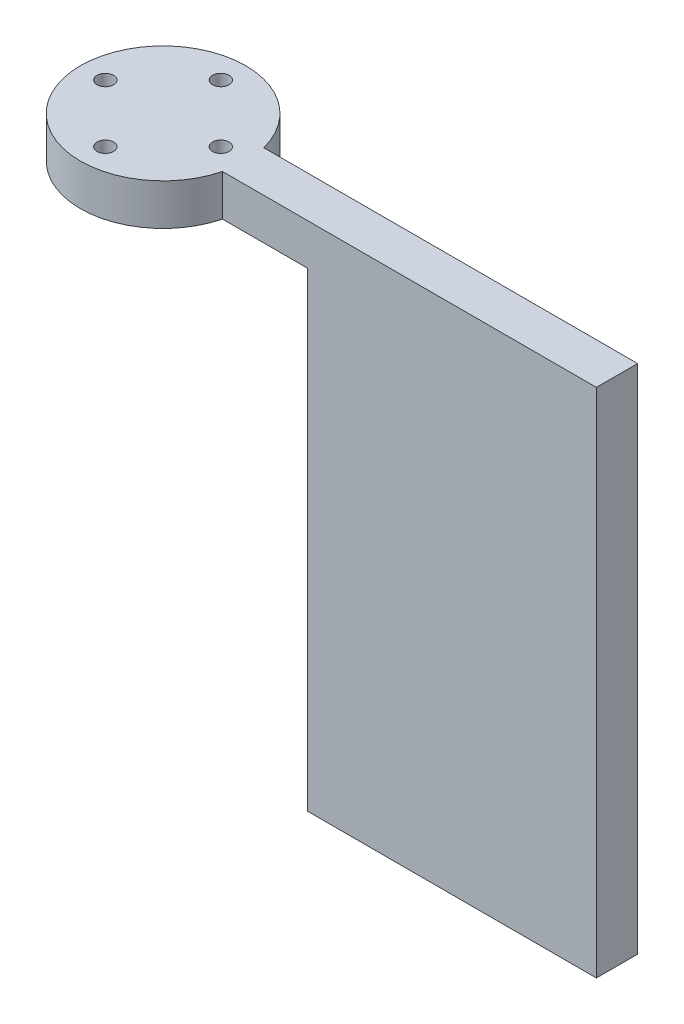
ISO-10303-21;
HEADER;
FILE_DESCRIPTION(('STEP AP214'),'2;1');
FILE_NAME('part.step','',(''),(''),'','','');
FILE_SCHEMA(('AUTOMOTIVE_DESIGN { 1 0 10303 214 1 1 1 1 }'));
ENDSEC;
DATA;
#1=APPLICATION_CONTEXT('core data for automotive mechanical design processes');
#2=APPLICATION_PROTOCOL_DEFINITION('international standard','automotive_design',2000,#1);
#3=PRODUCT_CONTEXT('',#1,'mechanical');
#4=PRODUCT('Part','Part','',(#3));
#5=PRODUCT_RELATED_PRODUCT_CATEGORY('part','',(#4));
#6=PRODUCT_DEFINITION_FORMATION('','',#4);
#7=PRODUCT_DEFINITION_CONTEXT('part definition',#1,'design');
#8=PRODUCT_DEFINITION('design','',#6,#7);
#9=PRODUCT_DEFINITION_SHAPE('','',#8);
#10=(LENGTH_UNIT() NAMED_UNIT(*) SI_UNIT(.MILLI.,.METRE.));
#11=(NAMED_UNIT(*) PLANE_ANGLE_UNIT() SI_UNIT($,.RADIAN.));
#12=(NAMED_UNIT(*) SI_UNIT($,.STERADIAN.) SOLID_ANGLE_UNIT());
#13=UNCERTAINTY_MEASURE_WITH_UNIT(LENGTH_MEASURE(1.E-05),#10,'distance_accuracy_value','');
#14=(GEOMETRIC_REPRESENTATION_CONTEXT(3) GLOBAL_UNCERTAINTY_ASSIGNED_CONTEXT((#13)) GLOBAL_UNIT_ASSIGNED_CONTEXT((#10,
#11,#12)) REPRESENTATION_CONTEXT('',''));
#15=CARTESIAN_POINT('',(0.,0.,0.));
#16=DIRECTION('',(0.,0.,1.));
#17=DIRECTION('',(1.,0.,0.));
#18=AXIS2_PLACEMENT_3D('',#15,#16,#17);
#19=CARTESIAN_POINT('',(0.,0.,2.5));
#20=DIRECTION('',(0.,1.,0.));
#21=DIRECTION('',(0.,0.,1.));
#22=AXIS2_PLACEMENT_3D('',#19,#20,#21);
#23=PLANE('',#22);
#24=DIRECTION('',(1.,0.,0.));
#25=VECTOR('',#24,1.);
#26=CARTESIAN_POINT('',(0.,0.,-2.5));
#27=LINE('',#26,#25);
#28=CARTESIAN_POINT('',(0.,0.,-2.5));
#29=VERTEX_POINT('',#28);
#30=CARTESIAN_POINT('',(35.,0.,-2.5));
#31=VERTEX_POINT('',#30);
#32=EDGE_CURVE('E145',#29,#31,#27,.T.);
#33=ORIENTED_EDGE('',*,*,#32,.T.);
#34=DIRECTION('',(0.,0.,-1.));
#35=VECTOR('',#34,1.);
#36=CARTESIAN_POINT('',(35.,0.,2.5));
#37=LINE('',#36,#35);
#38=CARTESIAN_POINT('',(35.,0.,2.5));
#39=VERTEX_POINT('',#38);
#40=EDGE_CURVE('E11',#39,#31,#37,.T.);
#41=ORIENTED_EDGE('',*,*,#40,.F.);
#42=DIRECTION('',(1.,0.,0.));
#43=VECTOR('',#42,1.);
#44=CARTESIAN_POINT('',(0.,0.,2.5));
#45=LINE('',#44,#43);
#46=CARTESIAN_POINT('',(0.,0.,2.5));
#47=VERTEX_POINT('',#46);
#48=EDGE_CURVE('E146',#47,#39,#45,.T.);
#49=ORIENTED_EDGE('',*,*,#48,.F.);
#50=DIRECTION('',(0.,0.,-1.));
#51=VECTOR('',#50,1.);
#52=CARTESIAN_POINT('',(0.,0.,2.5));
#53=LINE('',#52,#51);
#54=EDGE_CURVE('E57',#47,#29,#53,.T.);
#55=ORIENTED_EDGE('',*,*,#54,.T.);
#56=EDGE_LOOP('',(#33,#41,#49,#55));
#57=FACE_BOUND('',#56,.T.);
#58=ADVANCED_FACE('F41',(#57),#23,.F.);
#59=CARTESIAN_POINT('',(35.,0.,2.5));
#60=DIRECTION('',(-1.,0.,0.));
#61=DIRECTION('',(0.,0.,1.));
#62=AXIS2_PLACEMENT_3D('',#59,#60,#61);
#63=PLANE('',#62);
#64=DIRECTION('',(0.,1.,0.));
#65=VECTOR('',#64,1.);
#66=CARTESIAN_POINT('',(35.,0.,-2.5));
#67=LINE('',#66,#65);
#68=CARTESIAN_POINT('',(35.,62.,-2.5));
#69=VERTEX_POINT('',#68);
#70=EDGE_CURVE('E156',#31,#69,#67,.T.);
#71=ORIENTED_EDGE('',*,*,#70,.T.);
#72=DIRECTION('',(0.,0.,-1.));
#73=VECTOR('',#72,1.);
#74=CARTESIAN_POINT('',(35.,62.,2.5));
#75=LINE('',#74,#73);
#76=CARTESIAN_POINT('',(35.,62.,2.5));
#77=VERTEX_POINT('',#76);
#78=EDGE_CURVE('E49',#77,#69,#75,.T.);
#79=ORIENTED_EDGE('',*,*,#78,.F.);
#80=DIRECTION('',(0.,1.,0.));
#81=VECTOR('',#80,1.);
#82=CARTESIAN_POINT('',(35.,0.,2.5));
#83=LINE('',#82,#81);
#84=EDGE_CURVE('E83',#39,#77,#83,.T.);
#85=ORIENTED_EDGE('',*,*,#84,.F.);
#86=ORIENTED_EDGE('',*,*,#40,.T.);
#87=EDGE_LOOP('',(#71,#79,#85,#86));
#88=FACE_BOUND('',#87,.T.);
#89=ADVANCED_FACE('F166',(#88),#63,.F.);
#90=CARTESIAN_POINT('',(0.,62.,2.5));
#91=DIRECTION('',(0.,1.,0.));
#92=DIRECTION('',(0.,0.,1.));
#93=AXIS2_PLACEMENT_3D('',#90,#91,#92);
#94=PLANE('',#93);
#95=DIRECTION('',(1.,0.,0.));
#96=VECTOR('',#95,1.);
#97=CARTESIAN_POINT('',(0.,62.,-2.5));
#98=LINE('',#97,#96);
#99=CARTESIAN_POINT('',(-10.316887097431,62.,-2.5));
#100=VERTEX_POINT('',#99);
#101=EDGE_CURVE('E108',#100,#69,#98,.T.);
#102=ORIENTED_EDGE('',*,*,#101,.F.);
#103=CARTESIAN_POINT('',(-20.02,62.,0.));
#104=DIRECTION('',(0.,1.,0.));
#105=DIRECTION('',(0.,0.,1.));
#106=AXIS2_PLACEMENT_3D('',#103,#104,#105);
#107=CIRCLE('',#106,10.02);
#108=CARTESIAN_POINT('',(-10.316887097431,62.,2.5));
#109=VERTEX_POINT('',#108);
#110=EDGE_CURVE('E115',#100,#109,#107,.T.);
#111=ORIENTED_EDGE('',*,*,#110,.T.);
#112=DIRECTION('',(1.,0.,0.));
#113=VECTOR('',#112,1.);
#114=CARTESIAN_POINT('',(0.,62.,2.5));
#115=LINE('',#114,#113);
#116=EDGE_CURVE('E149',#109,#77,#115,.T.);
#117=ORIENTED_EDGE('',*,*,#116,.T.);
#118=ORIENTED_EDGE('',*,*,#78,.T.);
#119=EDGE_LOOP('',(#102,#111,#117,#118));
#120=FACE_BOUND('',#119,.T.);
#121=CARTESIAN_POINT('',(-13.02,62.,0.));
#122=DIRECTION('',(0.,1.,0.));
#123=DIRECTION('',(0.,0.,1.));
#124=AXIS2_PLACEMENT_3D('',#121,#122,#123);
#125=CIRCLE('',#124,1.);
#126=CARTESIAN_POINT('',(-13.02,62.,1.));
#127=VERTEX_POINT('',#126);
#128=EDGE_CURVE('E130',#127,#127,#125,.T.);
#129=ORIENTED_EDGE('',*,*,#128,.F.);
#130=EDGE_LOOP('',(#129));
#131=FACE_BOUND('',#130,.T.);
#132=CARTESIAN_POINT('',(-20.02,62.,7.));
#133=DIRECTION('',(0.,1.,0.));
#134=DIRECTION('',(0.,0.,1.));
#135=AXIS2_PLACEMENT_3D('',#132,#133,#134);
#136=CIRCLE('',#135,1.);
#137=CARTESIAN_POINT('',(-20.02,62.,8.));
#138=VERTEX_POINT('',#137);
#139=EDGE_CURVE('E133',#138,#138,#136,.T.);
#140=ORIENTED_EDGE('',*,*,#139,.F.);
#141=EDGE_LOOP('',(#140));
#142=FACE_BOUND('',#141,.T.);
#143=CARTESIAN_POINT('',(-27.02,62.,0.));
#144=DIRECTION('',(0.,1.,0.));
#145=DIRECTION('',(0.,0.,1.));
#146=AXIS2_PLACEMENT_3D('',#143,#144,#145);
#147=CIRCLE('',#146,0.999999999999998);
#148=CARTESIAN_POINT('',(-27.02,62.,0.999999999999998));
#149=VERTEX_POINT('',#148);
#150=EDGE_CURVE('E136',#149,#149,#147,.T.);
#151=ORIENTED_EDGE('',*,*,#150,.F.);
#152=EDGE_LOOP('',(#151));
#153=FACE_BOUND('',#152,.T.);
#154=CARTESIAN_POINT('',(-20.02,62.,-7.));
#155=DIRECTION('',(0.,1.,0.));
#156=DIRECTION('',(0.,0.,1.));
#157=AXIS2_PLACEMENT_3D('',#154,#155,#156);
#158=CIRCLE('',#157,1.);
#159=CARTESIAN_POINT('',(-20.02,62.,-6.));
#160=VERTEX_POINT('',#159);
#161=EDGE_CURVE('E139',#160,#160,#158,.T.);
#162=ORIENTED_EDGE('',*,*,#161,.F.);
#163=EDGE_LOOP('',(#162));
#164=FACE_BOUND('',#163,.T.);
#165=ADVANCED_FACE('F163',(#120,#131,#142,#153,#164),#94,.T.);
#166=CARTESIAN_POINT('',(0.,57.,2.5));
#167=DIRECTION('',(0.,-1.,0.));
#168=DIRECTION('',(0.,0.,-1.));
#169=AXIS2_PLACEMENT_3D('',#166,#167,#168);
#170=PLANE('',#169);
#171=CARTESIAN_POINT('',(-20.02,57.,0.));
#172=DIRECTION('',(0.,1.,0.));
#173=DIRECTION('',(0.,0.,1.));
#174=AXIS2_PLACEMENT_3D('',#171,#172,#173);
#175=CIRCLE('',#174,10.02);
#176=CARTESIAN_POINT('',(-10.316887097431,57.,-2.5));
#177=VERTEX_POINT('',#176);
#178=CARTESIAN_POINT('',(-10.316887097431,57.,2.5));
#179=VERTEX_POINT('',#178);
#180=EDGE_CURVE('E113',#177,#179,#175,.T.);
#181=ORIENTED_EDGE('',*,*,#180,.F.);
#182=DIRECTION('',(-1.,0.,0.));
#183=VECTOR('',#182,1.);
#184=CARTESIAN_POINT('',(0.,57.,-2.5));
#185=LINE('',#184,#183);
#186=CARTESIAN_POINT('',(0.,57.,-2.5));
#187=VERTEX_POINT('',#186);
#188=EDGE_CURVE('E99',#187,#177,#185,.T.);
#189=ORIENTED_EDGE('',*,*,#188,.F.);
#190=DIRECTION('',(0.,0.,-1.));
#191=VECTOR('',#190,1.);
#192=CARTESIAN_POINT('',(0.,57.,2.5));
#193=LINE('',#192,#191);
#194=CARTESIAN_POINT('',(0.,57.,2.5));
#195=VERTEX_POINT('',#194);
#196=EDGE_CURVE('E72',#195,#187,#193,.T.);
#197=ORIENTED_EDGE('',*,*,#196,.F.);
#198=DIRECTION('',(-1.,0.,0.));
#199=VECTOR('',#198,1.);
#200=CARTESIAN_POINT('',(0.,57.,2.5));
#201=LINE('',#200,#199);
#202=EDGE_CURVE('E121',#195,#179,#201,.T.);
#203=ORIENTED_EDGE('',*,*,#202,.T.);
#204=EDGE_LOOP('',(#181,#189,#197,#203));
#205=FACE_BOUND('',#204,.T.);
#206=CARTESIAN_POINT('',(-13.02,57.,0.));
#207=DIRECTION('',(0.,1.,0.));
#208=DIRECTION('',(0.,0.,1.));
#209=AXIS2_PLACEMENT_3D('',#206,#207,#208);
#210=CIRCLE('',#209,1.);
#211=CARTESIAN_POINT('',(-13.02,57.,1.));
#212=VERTEX_POINT('',#211);
#213=EDGE_CURVE('E142',#212,#212,#210,.T.);
#214=ORIENTED_EDGE('',*,*,#213,.T.);
#215=EDGE_LOOP('',(#214));
#216=FACE_BOUND('',#215,.T.);
#217=CARTESIAN_POINT('',(-20.02,57.,7.));
#218=DIRECTION('',(0.,1.,0.));
#219=DIRECTION('',(0.,0.,1.));
#220=AXIS2_PLACEMENT_3D('',#217,#218,#219);
#221=CIRCLE('',#220,1.);
#222=CARTESIAN_POINT('',(-20.02,57.,8.));
#223=VERTEX_POINT('',#222);
#224=EDGE_CURVE('E322',#223,#223,#221,.T.);
#225=ORIENTED_EDGE('',*,*,#224,.T.);
#226=EDGE_LOOP('',(#225));
#227=FACE_BOUND('',#226,.T.);
#228=CARTESIAN_POINT('',(-27.02,57.,0.));
#229=DIRECTION('',(0.,1.,0.));
#230=DIRECTION('',(0.,0.,1.));
#231=AXIS2_PLACEMENT_3D('',#228,#229,#230);
#232=CIRCLE('',#231,0.999999999999998);
#233=CARTESIAN_POINT('',(-27.02,57.,0.999999999999998));
#234=VERTEX_POINT('',#233);
#235=EDGE_CURVE('E126',#234,#234,#232,.T.);
#236=ORIENTED_EDGE('',*,*,#235,.T.);
#237=EDGE_LOOP('',(#236));
#238=FACE_BOUND('',#237,.T.);
#239=CARTESIAN_POINT('',(-20.02,57.,-7.));
#240=DIRECTION('',(0.,1.,0.));
#241=DIRECTION('',(0.,0.,1.));
#242=AXIS2_PLACEMENT_3D('',#239,#240,#241);
#243=CIRCLE('',#242,1.);
#244=CARTESIAN_POINT('',(-20.02,57.,-6.));
#245=VERTEX_POINT('',#244);
#246=EDGE_CURVE('E123',#245,#245,#243,.T.);
#247=ORIENTED_EDGE('',*,*,#246,.T.);
#248=EDGE_LOOP('',(#247));
#249=FACE_BOUND('',#248,.T.);
#250=ADVANCED_FACE('F118',(#205,#216,#227,#238,#249),#170,.T.);
#251=CARTESIAN_POINT('',(0.,0.,2.5));
#252=DIRECTION('',(-1.,0.,0.));
#253=DIRECTION('',(0.,0.,1.));
#254=AXIS2_PLACEMENT_3D('',#251,#252,#253);
#255=PLANE('',#254);
#256=DIRECTION('',(0.,1.,0.));
#257=VECTOR('',#256,1.);
#258=CARTESIAN_POINT('',(0.,0.,-2.5));
#259=LINE('',#258,#257);
#260=EDGE_CURVE('E105',#29,#187,#259,.T.);
#261=ORIENTED_EDGE('',*,*,#260,.F.);
#262=ORIENTED_EDGE('',*,*,#54,.F.);
#263=DIRECTION('',(0.,1.,0.));
#264=VECTOR('',#263,1.);
#265=CARTESIAN_POINT('',(0.,0.,2.5));
#266=LINE('',#265,#264);
#267=EDGE_CURVE('E153',#47,#195,#266,.T.);
#268=ORIENTED_EDGE('',*,*,#267,.T.);
#269=ORIENTED_EDGE('',*,*,#196,.T.);
#270=EDGE_LOOP('',(#261,#262,#268,#269));
#271=FACE_BOUND('',#270,.T.);
#272=ADVANCED_FACE('F168',(#271),#255,.T.);
#273=CARTESIAN_POINT('',(0.,0.,2.5));
#274=DIRECTION('',(0.,0.,1.));
#275=DIRECTION('',(1.,0.,0.));
#276=AXIS2_PLACEMENT_3D('',#273,#274,#275);
#277=PLANE('',#276);
#278=ORIENTED_EDGE('',*,*,#48,.T.);
#279=ORIENTED_EDGE('',*,*,#84,.T.);
#280=ORIENTED_EDGE('',*,*,#116,.F.);
#281=DIRECTION('',(0.,1.,0.));
#282=VECTOR('',#281,1.);
#283=CARTESIAN_POINT('',(-10.316887097431,57.,2.5));
#284=LINE('',#283,#282);
#285=EDGE_CURVE('E116',#179,#109,#284,.T.);
#286=ORIENTED_EDGE('',*,*,#285,.F.);
#287=ORIENTED_EDGE('',*,*,#202,.F.);
#288=ORIENTED_EDGE('',*,*,#267,.F.);
#289=EDGE_LOOP('',(#278,#279,#280,#286,#287,#288));
#290=FACE_BOUND('',#289,.T.);
#291=ADVANCED_FACE('F170',(#290),#277,.T.);
#292=CARTESIAN_POINT('',(0.,0.,-2.5));
#293=DIRECTION('',(0.,0.,1.));
#294=DIRECTION('',(1.,0.,0.));
#295=AXIS2_PLACEMENT_3D('',#292,#293,#294);
#296=PLANE('',#295);
#297=ORIENTED_EDGE('',*,*,#32,.F.);
#298=ORIENTED_EDGE('',*,*,#260,.T.);
#299=ORIENTED_EDGE('',*,*,#188,.T.);
#300=DIRECTION('',(0.,1.,0.));
#301=VECTOR('',#300,1.);
#302=CARTESIAN_POINT('',(-10.316887097431,57.,-2.5));
#303=LINE('',#302,#301);
#304=EDGE_CURVE('E103',#177,#100,#303,.T.);
#305=ORIENTED_EDGE('',*,*,#304,.T.);
#306=ORIENTED_EDGE('',*,*,#101,.T.);
#307=ORIENTED_EDGE('',*,*,#70,.F.);
#308=EDGE_LOOP('',(#297,#298,#299,#305,#306,#307));
#309=FACE_BOUND('',#308,.T.);
#310=ADVANCED_FACE('F101',(#309),#296,.F.);
#311=CARTESIAN_POINT('',(-20.02,57.,0.));
#312=DIRECTION('',(0.,1.,0.));
#313=DIRECTION('',(0.,0.,1.));
#314=AXIS2_PLACEMENT_3D('',#311,#312,#313);
#315=CYLINDRICAL_SURFACE('',#314,10.02);
#316=ORIENTED_EDGE('',*,*,#180,.T.);
#317=ORIENTED_EDGE('',*,*,#285,.T.);
#318=ORIENTED_EDGE('',*,*,#110,.F.);
#319=ORIENTED_EDGE('',*,*,#304,.F.);
#320=EDGE_LOOP('',(#316,#317,#318,#319));
#321=FACE_BOUND('',#320,.T.);
#322=ADVANCED_FACE('F111',(#321),#315,.T.);
#323=CARTESIAN_POINT('',(-20.02,57.,-7.));
#324=DIRECTION('',(0.,1.,0.));
#325=DIRECTION('',(0.,0.,1.));
#326=AXIS2_PLACEMENT_3D('',#323,#324,#325);
#327=CYLINDRICAL_SURFACE('',#326,1.);
#328=ORIENTED_EDGE('',*,*,#246,.F.);
#329=EDGE_LOOP('',(#328));
#330=FACE_BOUND('',#329,.T.);
#331=ORIENTED_EDGE('',*,*,#161,.T.);
#332=EDGE_LOOP('',(#331));
#333=FACE_BOUND('',#332,.T.);
#334=ADVANCED_FACE('F213',(#330,#333),#327,.F.);
#335=CARTESIAN_POINT('',(-27.02,57.,0.));
#336=DIRECTION('',(0.,1.,0.));
#337=DIRECTION('',(0.,0.,1.));
#338=AXIS2_PLACEMENT_3D('',#335,#336,#337);
#339=CYLINDRICAL_SURFACE('',#338,0.999999999999998);
#340=ORIENTED_EDGE('',*,*,#235,.F.);
#341=EDGE_LOOP('',(#340));
#342=FACE_BOUND('',#341,.T.);
#343=ORIENTED_EDGE('',*,*,#150,.T.);
#344=EDGE_LOOP('',(#343));
#345=FACE_BOUND('',#344,.T.);
#346=ADVANCED_FACE('F221',(#342,#345),#339,.F.);
#347=CARTESIAN_POINT('',(-20.02,57.,7.));
#348=DIRECTION('',(0.,1.,0.));
#349=DIRECTION('',(0.,0.,1.));
#350=AXIS2_PLACEMENT_3D('',#347,#348,#349);
#351=CYLINDRICAL_SURFACE('',#350,1.);
#352=ORIENTED_EDGE('',*,*,#224,.F.);
#353=EDGE_LOOP('',(#352));
#354=FACE_BOUND('',#353,.T.);
#355=ORIENTED_EDGE('',*,*,#139,.T.);
#356=EDGE_LOOP('',(#355));
#357=FACE_BOUND('',#356,.T.);
#358=ADVANCED_FACE('F229',(#354,#357),#351,.F.);
#359=CARTESIAN_POINT('',(-13.02,57.,0.));
#360=DIRECTION('',(0.,1.,0.));
#361=DIRECTION('',(0.,0.,1.));
#362=AXIS2_PLACEMENT_3D('',#359,#360,#361);
#363=CYLINDRICAL_SURFACE('',#362,1.);
#364=ORIENTED_EDGE('',*,*,#213,.F.);
#365=EDGE_LOOP('',(#364));
#366=FACE_BOUND('',#365,.T.);
#367=ORIENTED_EDGE('',*,*,#128,.T.);
#368=EDGE_LOOP('',(#367));
#369=FACE_BOUND('',#368,.T.);
#370=ADVANCED_FACE('F237',(#366,#369),#363,.F.);
#371=CLOSED_SHELL('',(#58,#89,#165,#250,#272,#291,#310,#322,#334,#346,#358,#370));
#372=MANIFOLD_SOLID_BREP('B2',#371);
#373=ADVANCED_BREP_SHAPE_REPRESENTATION('',(#18,#372),#14);
#374=SHAPE_DEFINITION_REPRESENTATION(#9,#373);
ENDSEC;
END-ISO-10303-21;
